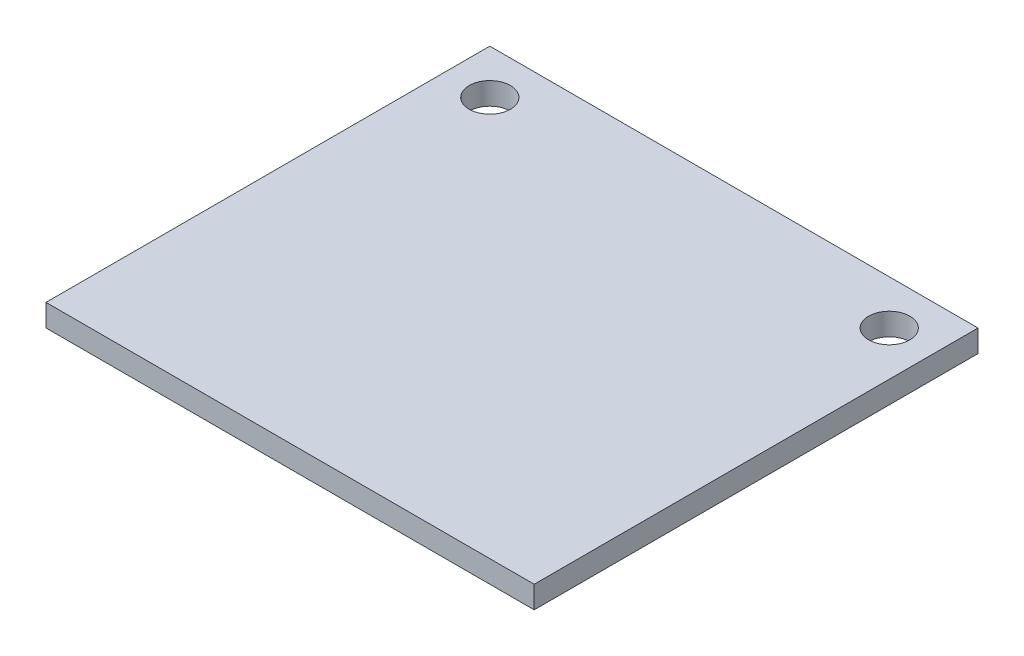
ISO-10303-21;
HEADER;
FILE_DESCRIPTION(('STEP AP214'),'2;1');
FILE_NAME('part.step','',(''),(''),'','','');
FILE_SCHEMA(('AUTOMOTIVE_DESIGN { 1 0 10303 214 1 1 1 1 }'));
ENDSEC;
DATA;
#1=APPLICATION_CONTEXT('core data for automotive mechanical design processes');
#2=APPLICATION_PROTOCOL_DEFINITION('international standard','automotive_design',2000,#1);
#3=PRODUCT_CONTEXT('',#1,'mechanical');
#4=PRODUCT('Part','Part','',(#3));
#5=PRODUCT_RELATED_PRODUCT_CATEGORY('part','',(#4));
#6=PRODUCT_DEFINITION_FORMATION('','',#4);
#7=PRODUCT_DEFINITION_CONTEXT('part definition',#1,'design');
#8=PRODUCT_DEFINITION('design','',#6,#7);
#9=PRODUCT_DEFINITION_SHAPE('','',#8);
#10=(LENGTH_UNIT() NAMED_UNIT(*) SI_UNIT(.MILLI.,.METRE.));
#11=(NAMED_UNIT(*) PLANE_ANGLE_UNIT() SI_UNIT($,.RADIAN.));
#12=(NAMED_UNIT(*) SI_UNIT($,.STERADIAN.) SOLID_ANGLE_UNIT());
#13=UNCERTAINTY_MEASURE_WITH_UNIT(LENGTH_MEASURE(1.E-05),#10,'distance_accuracy_value','');
#14=(GEOMETRIC_REPRESENTATION_CONTEXT(3) GLOBAL_UNCERTAINTY_ASSIGNED_CONTEXT((#13)) GLOBAL_UNIT_ASSIGNED_CONTEXT((#10,
#11,#12)) REPRESENTATION_CONTEXT('',''));
#15=CARTESIAN_POINT('',(0.,0.,0.));
#16=DIRECTION('',(0.,0.,1.));
#17=DIRECTION('',(1.,0.,0.));
#18=AXIS2_PLACEMENT_3D('',#15,#16,#17);
#19=CARTESIAN_POINT('',(0.,1.5875,0.));
#20=DIRECTION('',(1.,0.,0.));
#21=DIRECTION('',(0.,0.,-1.));
#22=AXIS2_PLACEMENT_3D('',#19,#20,#21);
#23=PLANE('',#22);
#24=DIRECTION('',(0.,0.,1.));
#25=VECTOR('',#24,1.);
#26=CARTESIAN_POINT('',(0.,0.,0.));
#27=LINE('',#26,#25);
#28=CARTESIAN_POINT('',(0.,0.,-31.75));
#29=VERTEX_POINT('',#28);
#30=CARTESIAN_POINT('',(0.,0.,0.));
#31=VERTEX_POINT('',#30);
#32=EDGE_CURVE('E96',#29,#31,#27,.T.);
#33=ORIENTED_EDGE('',*,*,#32,.T.);
#34=DIRECTION('',(0.,-1.,0.));
#35=VECTOR('',#34,1.);
#36=CARTESIAN_POINT('',(0.,1.5875,0.));
#37=LINE('',#36,#35);
#38=CARTESIAN_POINT('',(0.,1.5875,0.));
#39=VERTEX_POINT('',#38);
#40=EDGE_CURVE('E11',#39,#31,#37,.T.);
#41=ORIENTED_EDGE('',*,*,#40,.F.);
#42=DIRECTION('',(0.,0.,1.));
#43=VECTOR('',#42,1.);
#44=CARTESIAN_POINT('',(0.,1.5875,0.));
#45=LINE('',#44,#43);
#46=CARTESIAN_POINT('',(0.,1.5875,-31.75));
#47=VERTEX_POINT('',#46);
#48=EDGE_CURVE('E84',#47,#39,#45,.T.);
#49=ORIENTED_EDGE('',*,*,#48,.F.);
#50=DIRECTION('',(0.,-1.,0.));
#51=VECTOR('',#50,1.);
#52=CARTESIAN_POINT('',(0.,1.5875,-31.75));
#53=LINE('',#52,#51);
#54=EDGE_CURVE('E92',#47,#29,#53,.T.);
#55=ORIENTED_EDGE('',*,*,#54,.T.);
#56=EDGE_LOOP('',(#33,#41,#49,#55));
#57=FACE_BOUND('',#56,.T.);
#58=ADVANCED_FACE('F33',(#57),#23,.F.);
#59=CARTESIAN_POINT('',(0.,1.5875,0.));
#60=DIRECTION('',(0.,0.,-1.));
#61=DIRECTION('',(-1.,0.,0.));
#62=AXIS2_PLACEMENT_3D('',#59,#60,#61);
#63=PLANE('',#62);
#64=DIRECTION('',(1.,0.,0.));
#65=VECTOR('',#64,1.);
#66=CARTESIAN_POINT('',(0.,0.,0.));
#67=LINE('',#66,#65);
#68=CARTESIAN_POINT('',(34.925,0.,0.));
#69=VERTEX_POINT('',#68);
#70=EDGE_CURVE('E88',#31,#69,#67,.T.);
#71=ORIENTED_EDGE('',*,*,#70,.T.);
#72=DIRECTION('',(0.,-1.,0.));
#73=VECTOR('',#72,1.);
#74=CARTESIAN_POINT('',(34.925,1.5875,0.));
#75=LINE('',#74,#73);
#76=CARTESIAN_POINT('',(34.925,1.5875,0.));
#77=VERTEX_POINT('',#76);
#78=EDGE_CURVE('E41',#77,#69,#75,.T.);
#79=ORIENTED_EDGE('',*,*,#78,.F.);
#80=DIRECTION('',(1.,0.,0.));
#81=VECTOR('',#80,1.);
#82=CARTESIAN_POINT('',(0.,1.5875,0.));
#83=LINE('',#82,#81);
#84=EDGE_CURVE('E79',#39,#77,#83,.T.);
#85=ORIENTED_EDGE('',*,*,#84,.F.);
#86=ORIENTED_EDGE('',*,*,#40,.T.);
#87=EDGE_LOOP('',(#71,#79,#85,#86));
#88=FACE_BOUND('',#87,.T.);
#89=ADVANCED_FACE('F87',(#88),#63,.F.);
#90=CARTESIAN_POINT('',(34.925,1.5875,0.));
#91=DIRECTION('',(-1.,0.,0.));
#92=DIRECTION('',(0.,0.,1.));
#93=AXIS2_PLACEMENT_3D('',#90,#91,#92);
#94=PLANE('',#93);
#95=DIRECTION('',(0.,0.,-1.));
#96=VECTOR('',#95,1.);
#97=CARTESIAN_POINT('',(34.925,0.,0.));
#98=LINE('',#97,#96);
#99=CARTESIAN_POINT('',(34.925,0.,-31.75));
#100=VERTEX_POINT('',#99);
#101=EDGE_CURVE('E66',#69,#100,#98,.T.);
#102=ORIENTED_EDGE('',*,*,#101,.T.);
#103=DIRECTION('',(0.,-1.,0.));
#104=VECTOR('',#103,1.);
#105=CARTESIAN_POINT('',(34.925,1.5875,-31.75));
#106=LINE('',#105,#104);
#107=CARTESIAN_POINT('',(34.925,1.5875,-31.75));
#108=VERTEX_POINT('',#107);
#109=EDGE_CURVE('E89',#108,#100,#106,.T.);
#110=ORIENTED_EDGE('',*,*,#109,.F.);
#111=DIRECTION('',(0.,0.,-1.));
#112=VECTOR('',#111,1.);
#113=CARTESIAN_POINT('',(34.925,1.5875,0.));
#114=LINE('',#113,#112);
#115=EDGE_CURVE('E82',#77,#108,#114,.T.);
#116=ORIENTED_EDGE('',*,*,#115,.F.);
#117=ORIENTED_EDGE('',*,*,#78,.T.);
#118=EDGE_LOOP('',(#102,#110,#116,#117));
#119=FACE_BOUND('',#118,.T.);
#120=ADVANCED_FACE('F90',(#119),#94,.F.);
#121=CARTESIAN_POINT('',(0.,1.5875,-31.75));
#122=DIRECTION('',(0.,0.,1.));
#123=DIRECTION('',(1.,0.,0.));
#124=AXIS2_PLACEMENT_3D('',#121,#122,#123);
#125=PLANE('',#124);
#126=DIRECTION('',(-1.,0.,0.));
#127=VECTOR('',#126,1.);
#128=CARTESIAN_POINT('',(0.,0.,-31.75));
#129=LINE('',#128,#127);
#130=EDGE_CURVE('E72',#100,#29,#129,.T.);
#131=ORIENTED_EDGE('',*,*,#130,.T.);
#132=ORIENTED_EDGE('',*,*,#54,.F.);
#133=DIRECTION('',(-1.,0.,0.));
#134=VECTOR('',#133,1.);
#135=CARTESIAN_POINT('',(0.,1.5875,-31.75));
#136=LINE('',#135,#134);
#137=EDGE_CURVE('E49',#108,#47,#136,.T.);
#138=ORIENTED_EDGE('',*,*,#137,.F.);
#139=ORIENTED_EDGE('',*,*,#109,.T.);
#140=EDGE_LOOP('',(#131,#132,#138,#139));
#141=FACE_BOUND('',#140,.T.);
#142=ADVANCED_FACE('F104',(#141),#125,.F.);
#143=CARTESIAN_POINT('',(0.,1.5875,0.));
#144=DIRECTION('',(0.,-1.,0.));
#145=DIRECTION('',(0.,0.,-1.));
#146=AXIS2_PLACEMENT_3D('',#143,#144,#145);
#147=PLANE('',#146);
#148=CARTESIAN_POINT('',(31.75,1.5875,-28.575));
#149=DIRECTION('',(0.,1.,0.));
#150=DIRECTION('',(0.,0.,1.));
#151=AXIS2_PLACEMENT_3D('',#148,#149,#150);
#152=CIRCLE('',#151,1.4732);
#153=CARTESIAN_POINT('',(31.75,1.5875,-27.1018));
#154=VERTEX_POINT('',#153);
#155=EDGE_CURVE('E116',#154,#154,#152,.T.);
#156=ORIENTED_EDGE('',*,*,#155,.F.);
#157=EDGE_LOOP('',(#156));
#158=FACE_BOUND('',#157,.T.);
#159=CARTESIAN_POINT('',(3.175,1.5875,-28.575));
#160=DIRECTION('',(0.,1.,0.));
#161=DIRECTION('',(0.,0.,1.));
#162=AXIS2_PLACEMENT_3D('',#159,#160,#161);
#163=CIRCLE('',#162,1.4732);
#164=CARTESIAN_POINT('',(3.175,1.5875,-27.1018));
#165=VERTEX_POINT('',#164);
#166=EDGE_CURVE('E110',#165,#165,#163,.T.);
#167=ORIENTED_EDGE('',*,*,#166,.F.);
#168=EDGE_LOOP('',(#167));
#169=FACE_BOUND('',#168,.T.);
#170=ORIENTED_EDGE('',*,*,#48,.T.);
#171=ORIENTED_EDGE('',*,*,#84,.T.);
#172=ORIENTED_EDGE('',*,*,#115,.T.);
#173=ORIENTED_EDGE('',*,*,#137,.T.);
#174=EDGE_LOOP('',(#170,#171,#172,#173));
#175=FACE_BOUND('',#174,.T.);
#176=ADVANCED_FACE('F80',(#158,#169,#175),#147,.F.);
#177=CARTESIAN_POINT('',(0.,0.,0.));
#178=DIRECTION('',(0.,-1.,0.));
#179=DIRECTION('',(0.,0.,-1.));
#180=AXIS2_PLACEMENT_3D('',#177,#178,#179);
#181=PLANE('',#180);
#182=CARTESIAN_POINT('',(31.75,0.,-28.575));
#183=DIRECTION('',(0.,1.,0.));
#184=DIRECTION('',(0.,0.,1.));
#185=AXIS2_PLACEMENT_3D('',#182,#183,#184);
#186=CIRCLE('',#185,1.4732);
#187=CARTESIAN_POINT('',(31.75,0.,-27.1018));
#188=VERTEX_POINT('',#187);
#189=EDGE_CURVE('E113',#188,#188,#186,.T.);
#190=ORIENTED_EDGE('',*,*,#189,.T.);
#191=EDGE_LOOP('',(#190));
#192=FACE_BOUND('',#191,.T.);
#193=CARTESIAN_POINT('',(3.175,0.,-28.575));
#194=DIRECTION('',(0.,1.,0.));
#195=DIRECTION('',(0.,0.,1.));
#196=AXIS2_PLACEMENT_3D('',#193,#194,#195);
#197=CIRCLE('',#196,1.4732);
#198=CARTESIAN_POINT('',(3.175,0.,-27.1018));
#199=VERTEX_POINT('',#198);
#200=EDGE_CURVE('E99',#199,#199,#197,.T.);
#201=ORIENTED_EDGE('',*,*,#200,.T.);
#202=EDGE_LOOP('',(#201));
#203=FACE_BOUND('',#202,.T.);
#204=ORIENTED_EDGE('',*,*,#32,.F.);
#205=ORIENTED_EDGE('',*,*,#130,.F.);
#206=ORIENTED_EDGE('',*,*,#101,.F.);
#207=ORIENTED_EDGE('',*,*,#70,.F.);
#208=EDGE_LOOP('',(#204,#205,#206,#207));
#209=FACE_BOUND('',#208,.T.);
#210=ADVANCED_FACE('F107',(#192,#203,#209),#181,.T.);
#211=CARTESIAN_POINT('',(3.175,0.,-28.575));
#212=DIRECTION('',(0.,1.,0.));
#213=DIRECTION('',(0.,0.,1.));
#214=AXIS2_PLACEMENT_3D('',#211,#212,#213);
#215=CYLINDRICAL_SURFACE('',#214,1.4732);
#216=ORIENTED_EDGE('',*,*,#200,.F.);
#217=EDGE_LOOP('',(#216));
#218=FACE_BOUND('',#217,.T.);
#219=ORIENTED_EDGE('',*,*,#166,.T.);
#220=EDGE_LOOP('',(#219));
#221=FACE_BOUND('',#220,.T.);
#222=ADVANCED_FACE('F127',(#218,#221),#215,.F.);
#223=CARTESIAN_POINT('',(31.75,0.,-28.575));
#224=DIRECTION('',(0.,1.,0.));
#225=DIRECTION('',(0.,0.,1.));
#226=AXIS2_PLACEMENT_3D('',#223,#224,#225);
#227=CYLINDRICAL_SURFACE('',#226,1.4732);
#228=ORIENTED_EDGE('',*,*,#189,.F.);
#229=EDGE_LOOP('',(#228));
#230=FACE_BOUND('',#229,.T.);
#231=ORIENTED_EDGE('',*,*,#155,.T.);
#232=EDGE_LOOP('',(#231));
#233=FACE_BOUND('',#232,.T.);
#234=ADVANCED_FACE('F124',(#230,#233),#227,.F.);
#235=CLOSED_SHELL('',(#58,#89,#120,#142,#176,#210,#222,#234));
#236=MANIFOLD_SOLID_BREP('B2',#235);
#237=ADVANCED_BREP_SHAPE_REPRESENTATION('',(#18,#236),#14);
#238=SHAPE_DEFINITION_REPRESENTATION(#9,#237);
ENDSEC;
END-ISO-10303-21;
